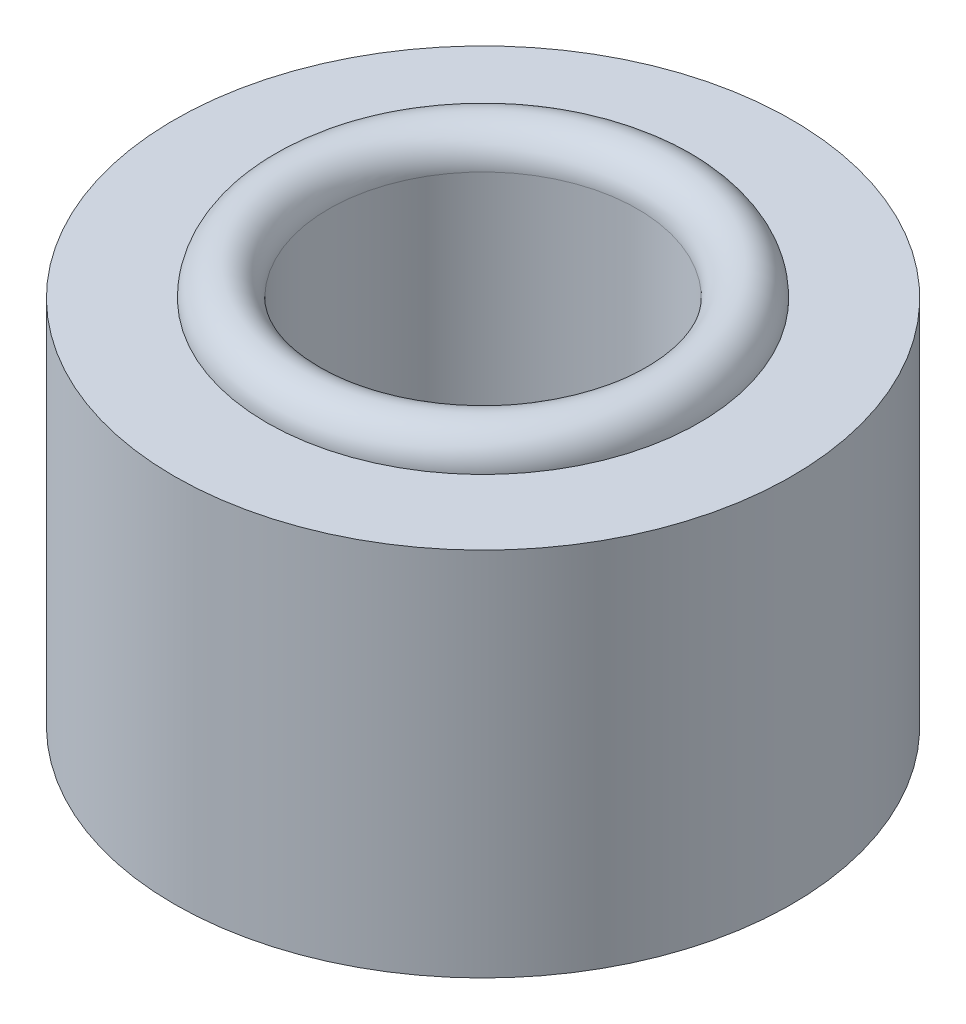
ISO-10303-21;
HEADER;
FILE_DESCRIPTION(('STEP AP214'),'2;1');
FILE_NAME('part.step','',(''),(''),'','','');
FILE_SCHEMA(('AUTOMOTIVE_DESIGN { 1 0 10303 214 1 1 1 1 }'));
ENDSEC;
DATA;
#1=APPLICATION_CONTEXT('core data for automotive mechanical design processes');
#2=APPLICATION_PROTOCOL_DEFINITION('international standard','automotive_design',2000,#1);
#3=PRODUCT_CONTEXT('',#1,'mechanical');
#4=PRODUCT('Part','Part','',(#3));
#5=PRODUCT_RELATED_PRODUCT_CATEGORY('part','',(#4));
#6=PRODUCT_DEFINITION_FORMATION('','',#4);
#7=PRODUCT_DEFINITION_CONTEXT('part definition',#1,'design');
#8=PRODUCT_DEFINITION('design','',#6,#7);
#9=PRODUCT_DEFINITION_SHAPE('','',#8);
#10=(LENGTH_UNIT() NAMED_UNIT(*) SI_UNIT(.MILLI.,.METRE.));
#11=(NAMED_UNIT(*) PLANE_ANGLE_UNIT() SI_UNIT($,.RADIAN.));
#12=(NAMED_UNIT(*) SI_UNIT($,.STERADIAN.) SOLID_ANGLE_UNIT());
#13=UNCERTAINTY_MEASURE_WITH_UNIT(LENGTH_MEASURE(1.E-05),#10,'distance_accuracy_value','');
#14=(GEOMETRIC_REPRESENTATION_CONTEXT(3) GLOBAL_UNCERTAINTY_ASSIGNED_CONTEXT((#13)) GLOBAL_UNIT_ASSIGNED_CONTEXT((#10,
#11,#12)) REPRESENTATION_CONTEXT('',''));
#15=CARTESIAN_POINT('',(0.,0.,0.));
#16=DIRECTION('',(0.,0.,1.));
#17=DIRECTION('',(1.,0.,0.));
#18=AXIS2_PLACEMENT_3D('',#15,#16,#17);
#19=CARTESIAN_POINT('',(0.,0.,0.));
#20=DIRECTION('',(0.,1.,0.));
#21=DIRECTION('',(0.,0.,1.));
#22=AXIS2_PLACEMENT_3D('',#19,#20,#21);
#23=TOROIDAL_SURFACE('',#22,6.,1.);
#24=CARTESIAN_POINT('',(0.,0.,0.));
#25=DIRECTION('',(0.,1.,0.));
#26=DIRECTION('',(0.,0.,1.));
#27=AXIS2_PLACEMENT_3D('',#24,#25,#26);
#28=CIRCLE('',#27,7.);
#29=CARTESIAN_POINT('',(0.,0.,7.));
#30=VERTEX_POINT('',#29);
#31=EDGE_CURVE('E57',#30,#30,#28,.T.);
#32=ORIENTED_EDGE('',*,*,#31,.F.);
#33=EDGE_LOOP('',(#32));
#34=FACE_BOUND('',#33,.T.);
#35=CARTESIAN_POINT('',(0.,0.,0.));
#36=DIRECTION('',(0.,1.,0.));
#37=DIRECTION('',(0.,0.,1.));
#38=AXIS2_PLACEMENT_3D('',#35,#36,#37);
#39=CIRCLE('',#38,5.);
#40=CARTESIAN_POINT('',(0.,0.,5.));
#41=VERTEX_POINT('',#40);
#42=EDGE_CURVE('E10',#41,#41,#39,.F.);
#43=ORIENTED_EDGE('',*,*,#42,.F.);
#44=EDGE_LOOP('',(#43));
#45=FACE_BOUND('',#44,.T.);
#46=ADVANCED_FACE('F34',(#34,#45),#23,.T.);
#47=CARTESIAN_POINT('',(0.,12.,0.));
#48=DIRECTION('',(0.,1.,0.));
#49=DIRECTION('',(0.,0.,1.));
#50=AXIS2_PLACEMENT_3D('',#47,#48,#49);
#51=TOROIDAL_SURFACE('',#50,6.,1.);
#52=CARTESIAN_POINT('',(0.,12.,0.));
#53=DIRECTION('',(0.,1.,0.));
#54=DIRECTION('',(0.,0.,1.));
#55=AXIS2_PLACEMENT_3D('',#52,#53,#54);
#56=CIRCLE('',#55,7.);
#57=CARTESIAN_POINT('',(0.,12.,7.));
#58=VERTEX_POINT('',#57);
#59=EDGE_CURVE('E53',#58,#58,#56,.T.);
#60=ORIENTED_EDGE('',*,*,#59,.T.);
#61=EDGE_LOOP('',(#60));
#62=FACE_BOUND('',#61,.T.);
#63=CARTESIAN_POINT('',(0.,12.,0.));
#64=DIRECTION('',(0.,1.,0.));
#65=DIRECTION('',(0.,0.,1.));
#66=AXIS2_PLACEMENT_3D('',#63,#64,#65);
#67=CIRCLE('',#66,5.);
#68=CARTESIAN_POINT('',(0.,12.,5.));
#69=VERTEX_POINT('',#68);
#70=EDGE_CURVE('E41',#69,#69,#67,.T.);
#71=ORIENTED_EDGE('',*,*,#70,.F.);
#72=EDGE_LOOP('',(#71));
#73=FACE_BOUND('',#72,.T.);
#74=ADVANCED_FACE('F66',(#62,#73),#51,.T.);
#75=CARTESIAN_POINT('',(0.,12.,0.));
#76=DIRECTION('',(0.,1.,0.));
#77=DIRECTION('',(0.,0.,1.));
#78=AXIS2_PLACEMENT_3D('',#75,#76,#77);
#79=PLANE('',#78);
#80=CARTESIAN_POINT('',(0.,12.,0.));
#81=DIRECTION('',(0.,1.,0.));
#82=DIRECTION('',(0.,0.,1.));
#83=AXIS2_PLACEMENT_3D('',#80,#81,#82);
#84=CIRCLE('',#83,10.);
#85=CARTESIAN_POINT('',(0.,12.,10.));
#86=VERTEX_POINT('',#85);
#87=EDGE_CURVE('E45',#86,#86,#84,.T.);
#88=ORIENTED_EDGE('',*,*,#87,.T.);
#89=EDGE_LOOP('',(#88));
#90=FACE_BOUND('',#89,.T.);
#91=ORIENTED_EDGE('',*,*,#59,.F.);
#92=EDGE_LOOP('',(#91));
#93=FACE_BOUND('',#92,.T.);
#94=ADVANCED_FACE('F70',(#90,#93),#79,.T.);
#95=CARTESIAN_POINT('',(0.,0.,0.));
#96=DIRECTION('',(0.,1.,0.));
#97=DIRECTION('',(0.,0.,1.));
#98=AXIS2_PLACEMENT_3D('',#95,#96,#97);
#99=PLANE('',#98);
#100=ORIENTED_EDGE('',*,*,#31,.T.);
#101=EDGE_LOOP('',(#100));
#102=FACE_BOUND('',#101,.T.);
#103=CARTESIAN_POINT('',(0.,0.,0.));
#104=DIRECTION('',(0.,1.,0.));
#105=DIRECTION('',(0.,0.,1.));
#106=AXIS2_PLACEMENT_3D('',#103,#104,#105);
#107=CIRCLE('',#106,10.);
#108=CARTESIAN_POINT('',(0.,0.,10.));
#109=VERTEX_POINT('',#108);
#110=EDGE_CURVE('E49',#109,#109,#107,.T.);
#111=ORIENTED_EDGE('',*,*,#110,.F.);
#112=EDGE_LOOP('',(#111));
#113=FACE_BOUND('',#112,.T.);
#114=ADVANCED_FACE('F61',(#102,#113),#99,.F.);
#115=CARTESIAN_POINT('',(0.,12.,0.));
#116=DIRECTION('',(0.,-1.,0.));
#117=DIRECTION('',(0.,0.,-1.));
#118=AXIS2_PLACEMENT_3D('',#115,#116,#117);
#119=CYLINDRICAL_SURFACE('',#118,10.);
#120=ORIENTED_EDGE('',*,*,#87,.F.);
#121=EDGE_LOOP('',(#120));
#122=FACE_BOUND('',#121,.T.);
#123=ORIENTED_EDGE('',*,*,#110,.T.);
#124=EDGE_LOOP('',(#123));
#125=FACE_BOUND('',#124,.T.);
#126=ADVANCED_FACE('F82',(#122,#125),#119,.T.);
#127=CARTESIAN_POINT('',(0.,12.,0.));
#128=DIRECTION('',(0.,-1.,0.));
#129=DIRECTION('',(0.,0.,-1.));
#130=AXIS2_PLACEMENT_3D('',#127,#128,#129);
#131=CYLINDRICAL_SURFACE('',#130,5.);
#132=ORIENTED_EDGE('',*,*,#42,.T.);
#133=EDGE_LOOP('',(#132));
#134=FACE_BOUND('',#133,.T.);
#135=ORIENTED_EDGE('',*,*,#70,.T.);
#136=EDGE_LOOP('',(#135));
#137=FACE_BOUND('',#136,.T.);
#138=ADVANCED_FACE('F85',(#134,#137),#131,.F.);
#139=CLOSED_SHELL('',(#46,#74,#94,#114,#126,#138));
#140=MANIFOLD_SOLID_BREP('B2',#139);
#141=ADVANCED_BREP_SHAPE_REPRESENTATION('',(#18,#140),#14);
#142=SHAPE_DEFINITION_REPRESENTATION(#9,#141);
ENDSEC;
END-ISO-10303-21;
